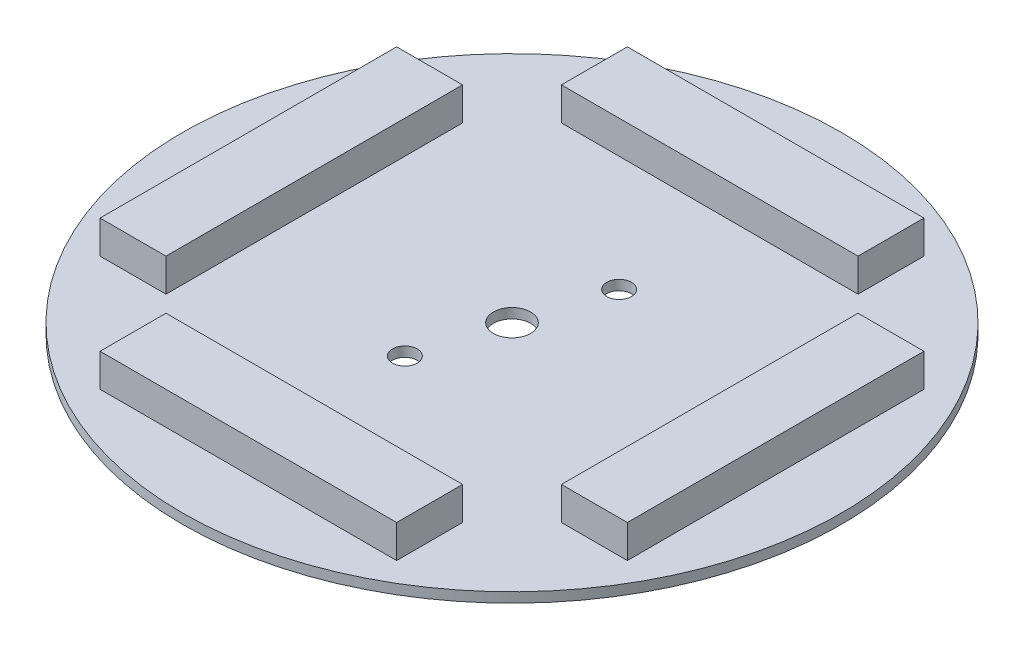
ISO-10303-21;
HEADER;
FILE_DESCRIPTION(('STEP AP214'),'2;1');
FILE_NAME('part.step','',(''),(''),'','','');
FILE_SCHEMA(('AUTOMOTIVE_DESIGN { 1 0 10303 214 1 1 1 1 }'));
ENDSEC;
DATA;
#1=APPLICATION_CONTEXT('core data for automotive mechanical design processes');
#2=APPLICATION_PROTOCOL_DEFINITION('international standard','automotive_design',2000,#1);
#3=PRODUCT_CONTEXT('',#1,'mechanical');
#4=PRODUCT('Part','Part','',(#3));
#5=PRODUCT_RELATED_PRODUCT_CATEGORY('part','',(#4));
#6=PRODUCT_DEFINITION_FORMATION('','',#4);
#7=PRODUCT_DEFINITION_CONTEXT('part definition',#1,'design');
#8=PRODUCT_DEFINITION('design','',#6,#7);
#9=PRODUCT_DEFINITION_SHAPE('','',#8);
#10=(LENGTH_UNIT() NAMED_UNIT(*) SI_UNIT(.MILLI.,.METRE.));
#11=(NAMED_UNIT(*) PLANE_ANGLE_UNIT() SI_UNIT($,.RADIAN.));
#12=(NAMED_UNIT(*) SI_UNIT($,.STERADIAN.) SOLID_ANGLE_UNIT());
#13=UNCERTAINTY_MEASURE_WITH_UNIT(LENGTH_MEASURE(1.E-05),#10,'distance_accuracy_value','');
#14=(GEOMETRIC_REPRESENTATION_CONTEXT(3) GLOBAL_UNCERTAINTY_ASSIGNED_CONTEXT((#13)) GLOBAL_UNIT_ASSIGNED_CONTEXT((#10,
#11,#12)) REPRESENTATION_CONTEXT('',''));
#15=CARTESIAN_POINT('',(0.,0.,0.));
#16=DIRECTION('',(0.,0.,1.));
#17=DIRECTION('',(1.,0.,0.));
#18=AXIS2_PLACEMENT_3D('',#15,#16,#17);
#19=CARTESIAN_POINT('',(0.,0.6,0.));
#20=DIRECTION('',(0.,1.,0.));
#21=DIRECTION('',(0.,0.,1.));
#22=AXIS2_PLACEMENT_3D('',#19,#20,#21);
#23=PLANE('',#22);
#24=CARTESIAN_POINT('',(0.,0.6,0.));
#25=DIRECTION('',(0.,1.,0.));
#26=DIRECTION('',(0.,0.,1.));
#27=AXIS2_PLACEMENT_3D('',#24,#25,#26);
#28=CIRCLE('',#27,1.1303);
#29=CARTESIAN_POINT('',(0.,0.6,1.1303));
#30=VERTEX_POINT('',#29);
#31=EDGE_CURVE('E301',#30,#30,#28,.T.);
#32=ORIENTED_EDGE('',*,*,#31,.F.);
#33=EDGE_LOOP('',(#32));
#34=FACE_BOUND('',#33,.T.);
#35=CARTESIAN_POINT('',(0.,0.6,0.));
#36=DIRECTION('',(0.,1.,0.));
#37=DIRECTION('',(0.,0.,1.));
#38=AXIS2_PLACEMENT_3D('',#35,#36,#37);
#39=CIRCLE('',#38,20.);
#40=CARTESIAN_POINT('',(0.,0.6,20.));
#41=VERTEX_POINT('',#40);
#42=EDGE_CURVE('E12',#41,#41,#39,.T.);
#43=ORIENTED_EDGE('',*,*,#42,.T.);
#44=EDGE_LOOP('',(#43));
#45=FACE_BOUND('',#44,.T.);
#46=CARTESIAN_POINT('',(-1.5,0.6,5.));
#47=DIRECTION('',(0.,1.,0.));
#48=DIRECTION('',(0.,0.,1.));
#49=AXIS2_PLACEMENT_3D('',#46,#47,#48);
#50=CIRCLE('',#49,0.75);
#51=CARTESIAN_POINT('',(-1.5,0.6,5.75));
#52=VERTEX_POINT('',#51);
#53=EDGE_CURVE('E307',#52,#52,#50,.T.);
#54=ORIENTED_EDGE('',*,*,#53,.F.);
#55=EDGE_LOOP('',(#54));
#56=FACE_BOUND('',#55,.T.);
#57=CARTESIAN_POINT('',(1.5,0.6,-5.));
#58=DIRECTION('',(0.,1.,0.));
#59=DIRECTION('',(0.,0.,1.));
#60=AXIS2_PLACEMENT_3D('',#57,#58,#59);
#61=CIRCLE('',#60,0.75);
#62=CARTESIAN_POINT('',(1.5,0.6,-4.25));
#63=VERTEX_POINT('',#62);
#64=EDGE_CURVE('E295',#63,#63,#61,.T.);
#65=ORIENTED_EDGE('',*,*,#64,.F.);
#66=EDGE_LOOP('',(#65));
#67=FACE_BOUND('',#66,.T.);
#68=DIRECTION('',(1.,0.,0.));
#69=VECTOR('',#68,1.);
#70=CARTESIAN_POINT('',(-9.,0.6,-12.));
#71=LINE('',#70,#69);
#72=CARTESIAN_POINT('',(-9.,0.6,-12.));
#73=VERTEX_POINT('',#72);
#74=CARTESIAN_POINT('',(9.,0.6,-12.));
#75=VERTEX_POINT('',#74);
#76=EDGE_CURVE('E277',#73,#75,#71,.T.);
#77=ORIENTED_EDGE('',*,*,#76,.F.);
#78=DIRECTION('',(0.,0.,1.));
#79=VECTOR('',#78,1.);
#80=CARTESIAN_POINT('',(-9.,0.6,-16.));
#81=LINE('',#80,#79);
#82=CARTESIAN_POINT('',(-9.,0.6,-16.));
#83=VERTEX_POINT('',#82);
#84=EDGE_CURVE('E261',#83,#73,#81,.T.);
#85=ORIENTED_EDGE('',*,*,#84,.F.);
#86=DIRECTION('',(1.,0.,0.));
#87=VECTOR('',#86,1.);
#88=CARTESIAN_POINT('',(-9.,0.6,-16.));
#89=LINE('',#88,#87);
#90=CARTESIAN_POINT('',(9.,0.6,-16.));
#91=VERTEX_POINT('',#90);
#92=EDGE_CURVE('E266',#83,#91,#89,.T.);
#93=ORIENTED_EDGE('',*,*,#92,.T.);
#94=DIRECTION('',(0.,0.,1.));
#95=VECTOR('',#94,1.);
#96=CARTESIAN_POINT('',(9.,0.6,-16.));
#97=LINE('',#96,#95);
#98=EDGE_CURVE('E280',#91,#75,#97,.T.);
#99=ORIENTED_EDGE('',*,*,#98,.T.);
#100=EDGE_LOOP('',(#77,#85,#93,#99));
#101=FACE_BOUND('',#100,.T.);
#102=DIRECTION('',(0.,0.,-1.));
#103=VECTOR('',#102,1.);
#104=CARTESIAN_POINT('',(-12.,0.6,9.00000000000004));
#105=LINE('',#104,#103);
#106=CARTESIAN_POINT('',(-12.,0.6,9.00000000000004));
#107=VERTEX_POINT('',#106);
#108=CARTESIAN_POINT('',(-12.,0.6,-8.99999999999996));
#109=VERTEX_POINT('',#108);
#110=EDGE_CURVE('E244',#107,#109,#105,.T.);
#111=ORIENTED_EDGE('',*,*,#110,.F.);
#112=DIRECTION('',(1.,0.,0.));
#113=VECTOR('',#112,1.);
#114=CARTESIAN_POINT('',(-16.,0.6,9.00000000000006));
#115=LINE('',#114,#113);
#116=CARTESIAN_POINT('',(-16.,0.6,9.00000000000006));
#117=VERTEX_POINT('',#116);
#118=EDGE_CURVE('E228',#117,#107,#115,.T.);
#119=ORIENTED_EDGE('',*,*,#118,.F.);
#120=DIRECTION('',(0.,0.,-1.));
#121=VECTOR('',#120,1.);
#122=CARTESIAN_POINT('',(-16.,0.6,9.00000000000006));
#123=LINE('',#122,#121);
#124=CARTESIAN_POINT('',(-16.,0.6,-8.99999999999994));
#125=VERTEX_POINT('',#124);
#126=EDGE_CURVE('E233',#117,#125,#123,.T.);
#127=ORIENTED_EDGE('',*,*,#126,.T.);
#128=DIRECTION('',(1.,0.,0.));
#129=VECTOR('',#128,1.);
#130=CARTESIAN_POINT('',(-16.,0.6,-8.99999999999994));
#131=LINE('',#130,#129);
#132=EDGE_CURVE('E247',#125,#109,#131,.T.);
#133=ORIENTED_EDGE('',*,*,#132,.T.);
#134=EDGE_LOOP('',(#111,#119,#127,#133));
#135=FACE_BOUND('',#134,.T.);
#136=DIRECTION('',(-1.,0.,0.));
#137=VECTOR('',#136,1.);
#138=CARTESIAN_POINT('',(9.,0.6,12.));
#139=LINE('',#138,#137);
#140=CARTESIAN_POINT('',(9.,0.6,12.));
#141=VERTEX_POINT('',#140);
#142=CARTESIAN_POINT('',(-9.,0.6,12.));
#143=VERTEX_POINT('',#142);
#144=EDGE_CURVE('E193',#141,#143,#139,.T.);
#145=ORIENTED_EDGE('',*,*,#144,.F.);
#146=DIRECTION('',(0.,0.,-1.));
#147=VECTOR('',#146,1.);
#148=CARTESIAN_POINT('',(9.,0.6,16.));
#149=LINE('',#148,#147);
#150=CARTESIAN_POINT('',(9.,0.6,16.));
#151=VERTEX_POINT('',#150);
#152=EDGE_CURVE('E190',#151,#141,#149,.T.);
#153=ORIENTED_EDGE('',*,*,#152,.F.);
#154=DIRECTION('',(-1.,0.,0.));
#155=VECTOR('',#154,1.);
#156=CARTESIAN_POINT('',(9.,0.6,16.));
#157=LINE('',#156,#155);
#158=CARTESIAN_POINT('',(-9.,0.6,16.));
#159=VERTEX_POINT('',#158);
#160=EDGE_CURVE('E203',#151,#159,#157,.T.);
#161=ORIENTED_EDGE('',*,*,#160,.T.);
#162=DIRECTION('',(0.,0.,-1.));
#163=VECTOR('',#162,1.);
#164=CARTESIAN_POINT('',(-9.,0.6,16.));
#165=LINE('',#164,#163);
#166=EDGE_CURVE('E214',#159,#143,#165,.T.);
#167=ORIENTED_EDGE('',*,*,#166,.T.);
#168=EDGE_LOOP('',(#145,#153,#161,#167));
#169=FACE_BOUND('',#168,.T.);
#170=DIRECTION('',(0.,0.,1.));
#171=VECTOR('',#170,1.);
#172=CARTESIAN_POINT('',(11.9999999999999,0.6,-9.00000000000012));
#173=LINE('',#172,#171);
#174=CARTESIAN_POINT('',(11.9999999999999,0.6,-9.00000000000012));
#175=VERTEX_POINT('',#174);
#176=CARTESIAN_POINT('',(12.0000000000001,0.6,8.99999999999988));
#177=VERTEX_POINT('',#176);
#178=EDGE_CURVE('E70',#175,#177,#173,.T.);
#179=ORIENTED_EDGE('',*,*,#178,.F.);
#180=DIRECTION('',(-1.,0.,0.));
#181=VECTOR('',#180,1.);
#182=CARTESIAN_POINT('',(15.9999999999999,0.6,-9.00000000000017));
#183=LINE('',#182,#181);
#184=CARTESIAN_POINT('',(15.9999999999999,0.6,-9.00000000000017));
#185=VERTEX_POINT('',#184);
#186=EDGE_CURVE('E189',#185,#175,#183,.T.);
#187=ORIENTED_EDGE('',*,*,#186,.F.);
#188=DIRECTION('',(0.,0.,1.));
#189=VECTOR('',#188,1.);
#190=CARTESIAN_POINT('',(15.9999999999999,0.6,-9.00000000000017));
#191=LINE('',#190,#189);
#192=CARTESIAN_POINT('',(16.0000000000001,0.6,8.99999999999983));
#193=VERTEX_POINT('',#192);
#194=EDGE_CURVE('E186',#185,#193,#191,.T.);
#195=ORIENTED_EDGE('',*,*,#194,.T.);
#196=DIRECTION('',(-1.,0.,0.));
#197=VECTOR('',#196,1.);
#198=CARTESIAN_POINT('',(16.0000000000001,0.6,8.99999999999983));
#199=LINE('',#198,#197);
#200=EDGE_CURVE('E75',#193,#177,#199,.T.);
#201=ORIENTED_EDGE('',*,*,#200,.T.);
#202=EDGE_LOOP('',(#179,#187,#195,#201));
#203=FACE_BOUND('',#202,.T.);
#204=ADVANCED_FACE('F55',(#34,#45,#56,#67,#101,#135,#169,#203),#23,.T.);
#205=CARTESIAN_POINT('',(0.,0.,0.));
#206=DIRECTION('',(0.,1.,0.));
#207=DIRECTION('',(0.,0.,1.));
#208=AXIS2_PLACEMENT_3D('',#205,#206,#207);
#209=PLANE('',#208);
#210=CARTESIAN_POINT('',(0.,0.,0.));
#211=DIRECTION('',(0.,1.,0.));
#212=DIRECTION('',(0.,0.,1.));
#213=AXIS2_PLACEMENT_3D('',#210,#211,#212);
#214=CIRCLE('',#213,20.);
#215=CARTESIAN_POINT('',(0.,0.,20.));
#216=VERTEX_POINT('',#215);
#217=EDGE_CURVE('E59',#216,#216,#214,.T.);
#218=ORIENTED_EDGE('',*,*,#217,.F.);
#219=EDGE_LOOP('',(#218));
#220=FACE_BOUND('',#219,.T.);
#221=CARTESIAN_POINT('',(-1.5,0.,5.));
#222=DIRECTION('',(0.,1.,0.));
#223=DIRECTION('',(0.,0.,1.));
#224=AXIS2_PLACEMENT_3D('',#221,#222,#223);
#225=CIRCLE('',#224,0.75);
#226=CARTESIAN_POINT('',(-1.5,0.,5.75));
#227=VERTEX_POINT('',#226);
#228=EDGE_CURVE('E304',#227,#227,#225,.T.);
#229=ORIENTED_EDGE('',*,*,#228,.T.);
#230=EDGE_LOOP('',(#229));
#231=FACE_BOUND('',#230,.T.);
#232=CARTESIAN_POINT('',(0.,0.,0.));
#233=DIRECTION('',(0.,1.,0.));
#234=DIRECTION('',(0.,0.,1.));
#235=AXIS2_PLACEMENT_3D('',#232,#233,#234);
#236=CIRCLE('',#235,1.1303);
#237=CARTESIAN_POINT('',(0.,0.,1.1303));
#238=VERTEX_POINT('',#237);
#239=EDGE_CURVE('E298',#238,#238,#236,.T.);
#240=ORIENTED_EDGE('',*,*,#239,.T.);
#241=EDGE_LOOP('',(#240));
#242=FACE_BOUND('',#241,.T.);
#243=CARTESIAN_POINT('',(1.5,0.,-5.));
#244=DIRECTION('',(0.,1.,0.));
#245=DIRECTION('',(0.,0.,1.));
#246=AXIS2_PLACEMENT_3D('',#243,#244,#245);
#247=CIRCLE('',#246,0.75);
#248=CARTESIAN_POINT('',(1.5,0.,-4.25));
#249=VERTEX_POINT('',#248);
#250=EDGE_CURVE('E294',#249,#249,#247,.T.);
#251=ORIENTED_EDGE('',*,*,#250,.T.);
#252=EDGE_LOOP('',(#251));
#253=FACE_BOUND('',#252,.T.);
#254=ADVANCED_FACE('F313',(#220,#231,#242,#253),#209,.F.);
#255=CARTESIAN_POINT('',(0.,0.6,0.));
#256=DIRECTION('',(0.,-1.,0.));
#257=DIRECTION('',(0.,0.,-1.));
#258=AXIS2_PLACEMENT_3D('',#255,#256,#257);
#259=CYLINDRICAL_SURFACE('',#258,20.);
#260=ORIENTED_EDGE('',*,*,#42,.F.);
#261=EDGE_LOOP('',(#260));
#262=FACE_BOUND('',#261,.T.);
#263=ORIENTED_EDGE('',*,*,#217,.T.);
#264=EDGE_LOOP('',(#263));
#265=FACE_BOUND('',#264,.T.);
#266=ADVANCED_FACE('F57',(#262,#265),#259,.T.);
#267=CARTESIAN_POINT('',(-1.5,0.6,5.));
#268=DIRECTION('',(0.,-1.,0.));
#269=DIRECTION('',(0.,0.,-1.));
#270=AXIS2_PLACEMENT_3D('',#267,#268,#269);
#271=CYLINDRICAL_SURFACE('',#270,0.75);
#272=ORIENTED_EDGE('',*,*,#53,.T.);
#273=EDGE_LOOP('',(#272));
#274=FACE_BOUND('',#273,.T.);
#275=ORIENTED_EDGE('',*,*,#228,.F.);
#276=EDGE_LOOP('',(#275));
#277=FACE_BOUND('',#276,.T.);
#278=ADVANCED_FACE('F316',(#274,#277),#271,.F.);
#279=CARTESIAN_POINT('',(0.,0.6,0.));
#280=DIRECTION('',(0.,-1.,0.));
#281=DIRECTION('',(0.,0.,-1.));
#282=AXIS2_PLACEMENT_3D('',#279,#280,#281);
#283=CYLINDRICAL_SURFACE('',#282,1.1303);
#284=ORIENTED_EDGE('',*,*,#31,.T.);
#285=EDGE_LOOP('',(#284));
#286=FACE_BOUND('',#285,.T.);
#287=ORIENTED_EDGE('',*,*,#239,.F.);
#288=EDGE_LOOP('',(#287));
#289=FACE_BOUND('',#288,.T.);
#290=ADVANCED_FACE('F318',(#286,#289),#283,.F.);
#291=CARTESIAN_POINT('',(1.5,0.6,-5.));
#292=DIRECTION('',(0.,-1.,0.));
#293=DIRECTION('',(0.,0.,-1.));
#294=AXIS2_PLACEMENT_3D('',#291,#292,#293);
#295=CYLINDRICAL_SURFACE('',#294,0.75);
#296=ORIENTED_EDGE('',*,*,#64,.T.);
#297=EDGE_LOOP('',(#296));
#298=FACE_BOUND('',#297,.T.);
#299=ORIENTED_EDGE('',*,*,#250,.F.);
#300=EDGE_LOOP('',(#299));
#301=FACE_BOUND('',#300,.T.);
#302=ADVANCED_FACE('F325',(#298,#301),#295,.F.);
#303=CARTESIAN_POINT('',(-9.,2.6,-16.));
#304=DIRECTION('',(1.,0.,0.));
#305=DIRECTION('',(0.,0.,-1.));
#306=AXIS2_PLACEMENT_3D('',#303,#304,#305);
#307=PLANE('',#306);
#308=ORIENTED_EDGE('',*,*,#84,.T.);
#309=DIRECTION('',(0.,-1.,0.));
#310=VECTOR('',#309,1.);
#311=CARTESIAN_POINT('',(-9.,2.6,-12.));
#312=LINE('',#311,#310);
#313=CARTESIAN_POINT('',(-9.,2.6,-12.));
#314=VERTEX_POINT('',#313);
#315=EDGE_CURVE('E291',#314,#73,#312,.T.);
#316=ORIENTED_EDGE('',*,*,#315,.F.);
#317=DIRECTION('',(0.,0.,1.));
#318=VECTOR('',#317,1.);
#319=CARTESIAN_POINT('',(-9.,2.6,-16.));
#320=LINE('',#319,#318);
#321=CARTESIAN_POINT('',(-9.,2.6,-16.));
#322=VERTEX_POINT('',#321);
#323=EDGE_CURVE('E262',#322,#314,#320,.T.);
#324=ORIENTED_EDGE('',*,*,#323,.F.);
#325=DIRECTION('',(0.,-1.,0.));
#326=VECTOR('',#325,1.);
#327=CARTESIAN_POINT('',(-9.,2.6,-16.));
#328=LINE('',#327,#326);
#329=EDGE_CURVE('E274',#322,#83,#328,.T.);
#330=ORIENTED_EDGE('',*,*,#329,.T.);
#331=EDGE_LOOP('',(#308,#316,#324,#330));
#332=FACE_BOUND('',#331,.T.);
#333=ADVANCED_FACE('F414',(#332),#307,.F.);
#334=CARTESIAN_POINT('',(-9.,2.6,-12.));
#335=DIRECTION('',(0.,0.,-1.));
#336=DIRECTION('',(-1.,0.,0.));
#337=AXIS2_PLACEMENT_3D('',#334,#335,#336);
#338=PLANE('',#337);
#339=ORIENTED_EDGE('',*,*,#76,.T.);
#340=DIRECTION('',(0.,-1.,0.));
#341=VECTOR('',#340,1.);
#342=CARTESIAN_POINT('',(9.,2.6,-12.));
#343=LINE('',#342,#341);
#344=CARTESIAN_POINT('',(9.,2.6,-12.));
#345=VERTEX_POINT('',#344);
#346=EDGE_CURVE('E288',#345,#75,#343,.T.);
#347=ORIENTED_EDGE('',*,*,#346,.F.);
#348=DIRECTION('',(1.,0.,0.));
#349=VECTOR('',#348,1.);
#350=CARTESIAN_POINT('',(-9.,2.6,-12.));
#351=LINE('',#350,#349);
#352=EDGE_CURVE('E265',#314,#345,#351,.T.);
#353=ORIENTED_EDGE('',*,*,#352,.F.);
#354=ORIENTED_EDGE('',*,*,#315,.T.);
#355=EDGE_LOOP('',(#339,#347,#353,#354));
#356=FACE_BOUND('',#355,.T.);
#357=ADVANCED_FACE('F410',(#356),#338,.F.);
#358=CARTESIAN_POINT('',(9.,2.6,-16.));
#359=DIRECTION('',(1.,0.,0.));
#360=DIRECTION('',(0.,0.,-1.));
#361=AXIS2_PLACEMENT_3D('',#358,#359,#360);
#362=PLANE('',#361);
#363=ORIENTED_EDGE('',*,*,#98,.F.);
#364=DIRECTION('',(0.,-1.,0.));
#365=VECTOR('',#364,1.);
#366=CARTESIAN_POINT('',(9.,2.6,-16.));
#367=LINE('',#366,#365);
#368=CARTESIAN_POINT('',(9.,2.6,-16.));
#369=VERTEX_POINT('',#368);
#370=EDGE_CURVE('E285',#369,#91,#367,.T.);
#371=ORIENTED_EDGE('',*,*,#370,.F.);
#372=DIRECTION('',(0.,0.,1.));
#373=VECTOR('',#372,1.);
#374=CARTESIAN_POINT('',(9.,2.6,-16.));
#375=LINE('',#374,#373);
#376=EDGE_CURVE('E268',#369,#345,#375,.T.);
#377=ORIENTED_EDGE('',*,*,#376,.T.);
#378=ORIENTED_EDGE('',*,*,#346,.T.);
#379=EDGE_LOOP('',(#363,#371,#377,#378));
#380=FACE_BOUND('',#379,.T.);
#381=ADVANCED_FACE('F406',(#380),#362,.T.);
#382=CARTESIAN_POINT('',(-9.,2.6,-16.));
#383=DIRECTION('',(0.,0.,-1.));
#384=DIRECTION('',(-1.,0.,0.));
#385=AXIS2_PLACEMENT_3D('',#382,#383,#384);
#386=PLANE('',#385);
#387=ORIENTED_EDGE('',*,*,#92,.F.);
#388=ORIENTED_EDGE('',*,*,#329,.F.);
#389=DIRECTION('',(1.,0.,0.));
#390=VECTOR('',#389,1.);
#391=CARTESIAN_POINT('',(-9.,2.6,-16.));
#392=LINE('',#391,#390);
#393=EDGE_CURVE('E271',#322,#369,#392,.T.);
#394=ORIENTED_EDGE('',*,*,#393,.T.);
#395=ORIENTED_EDGE('',*,*,#370,.T.);
#396=EDGE_LOOP('',(#387,#388,#394,#395));
#397=FACE_BOUND('',#396,.T.);
#398=ADVANCED_FACE('F402',(#397),#386,.T.);
#399=CARTESIAN_POINT('',(0.,2.6,0.));
#400=DIRECTION('',(0.,1.,0.));
#401=DIRECTION('',(0.,0.,1.));
#402=AXIS2_PLACEMENT_3D('',#399,#400,#401);
#403=PLANE('',#402);
#404=ORIENTED_EDGE('',*,*,#323,.T.);
#405=ORIENTED_EDGE('',*,*,#352,.T.);
#406=ORIENTED_EDGE('',*,*,#376,.F.);
#407=ORIENTED_EDGE('',*,*,#393,.F.);
#408=EDGE_LOOP('',(#404,#405,#406,#407));
#409=FACE_BOUND('',#408,.T.);
#410=ADVANCED_FACE('F398',(#409),#403,.T.);
#411=CARTESIAN_POINT('',(-16.,2.6,9.00000000000006));
#412=DIRECTION('',(0.,0.,-1.));
#413=DIRECTION('',(-1.,0.,0.));
#414=AXIS2_PLACEMENT_3D('',#411,#412,#413);
#415=PLANE('',#414);
#416=ORIENTED_EDGE('',*,*,#118,.T.);
#417=DIRECTION('',(0.,-1.,0.));
#418=VECTOR('',#417,1.);
#419=CARTESIAN_POINT('',(-12.,2.6,9.00000000000004));
#420=LINE('',#419,#418);
#421=CARTESIAN_POINT('',(-12.,2.6,9.00000000000004));
#422=VERTEX_POINT('',#421);
#423=EDGE_CURVE('E258',#422,#107,#420,.T.);
#424=ORIENTED_EDGE('',*,*,#423,.F.);
#425=DIRECTION('',(1.,0.,0.));
#426=VECTOR('',#425,1.);
#427=CARTESIAN_POINT('',(-16.,2.6,9.00000000000006));
#428=LINE('',#427,#426);
#429=CARTESIAN_POINT('',(-16.,2.6,9.00000000000006));
#430=VERTEX_POINT('',#429);
#431=EDGE_CURVE('E229',#430,#422,#428,.T.);
#432=ORIENTED_EDGE('',*,*,#431,.F.);
#433=DIRECTION('',(0.,-1.,0.));
#434=VECTOR('',#433,1.);
#435=CARTESIAN_POINT('',(-16.,2.6,9.00000000000006));
#436=LINE('',#435,#434);
#437=EDGE_CURVE('E241',#430,#117,#436,.T.);
#438=ORIENTED_EDGE('',*,*,#437,.T.);
#439=EDGE_LOOP('',(#416,#424,#432,#438));
#440=FACE_BOUND('',#439,.T.);
#441=ADVANCED_FACE('F394',(#440),#415,.F.);
#442=CARTESIAN_POINT('',(-12.,2.6,9.00000000000004));
#443=DIRECTION('',(-1.,0.,0.));
#444=DIRECTION('',(0.,0.,1.));
#445=AXIS2_PLACEMENT_3D('',#442,#443,#444);
#446=PLANE('',#445);
#447=ORIENTED_EDGE('',*,*,#110,.T.);
#448=DIRECTION('',(0.,-1.,0.));
#449=VECTOR('',#448,1.);
#450=CARTESIAN_POINT('',(-12.,2.6,-8.99999999999996));
#451=LINE('',#450,#449);
#452=CARTESIAN_POINT('',(-12.,2.6,-8.99999999999996));
#453=VERTEX_POINT('',#452);
#454=EDGE_CURVE('E255',#453,#109,#451,.T.);
#455=ORIENTED_EDGE('',*,*,#454,.F.);
#456=DIRECTION('',(0.,0.,-1.));
#457=VECTOR('',#456,1.);
#458=CARTESIAN_POINT('',(-12.,2.6,9.00000000000004));
#459=LINE('',#458,#457);
#460=EDGE_CURVE('E232',#422,#453,#459,.T.);
#461=ORIENTED_EDGE('',*,*,#460,.F.);
#462=ORIENTED_EDGE('',*,*,#423,.T.);
#463=EDGE_LOOP('',(#447,#455,#461,#462));
#464=FACE_BOUND('',#463,.T.);
#465=ADVANCED_FACE('F390',(#464),#446,.F.);
#466=CARTESIAN_POINT('',(-16.,2.6,-8.99999999999994));
#467=DIRECTION('',(0.,0.,-1.));
#468=DIRECTION('',(-1.,0.,0.));
#469=AXIS2_PLACEMENT_3D('',#466,#467,#468);
#470=PLANE('',#469);
#471=ORIENTED_EDGE('',*,*,#132,.F.);
#472=DIRECTION('',(0.,-1.,0.));
#473=VECTOR('',#472,1.);
#474=CARTESIAN_POINT('',(-16.,2.6,-8.99999999999994));
#475=LINE('',#474,#473);
#476=CARTESIAN_POINT('',(-16.,2.6,-8.99999999999994));
#477=VERTEX_POINT('',#476);
#478=EDGE_CURVE('E252',#477,#125,#475,.T.);
#479=ORIENTED_EDGE('',*,*,#478,.F.);
#480=DIRECTION('',(1.,0.,0.));
#481=VECTOR('',#480,1.);
#482=CARTESIAN_POINT('',(-16.,2.6,-8.99999999999994));
#483=LINE('',#482,#481);
#484=EDGE_CURVE('E235',#477,#453,#483,.T.);
#485=ORIENTED_EDGE('',*,*,#484,.T.);
#486=ORIENTED_EDGE('',*,*,#454,.T.);
#487=EDGE_LOOP('',(#471,#479,#485,#486));
#488=FACE_BOUND('',#487,.T.);
#489=ADVANCED_FACE('F386',(#488),#470,.T.);
#490=CARTESIAN_POINT('',(-16.,2.6,9.00000000000006));
#491=DIRECTION('',(-1.,0.,0.));
#492=DIRECTION('',(0.,0.,1.));
#493=AXIS2_PLACEMENT_3D('',#490,#491,#492);
#494=PLANE('',#493);
#495=ORIENTED_EDGE('',*,*,#126,.F.);
#496=ORIENTED_EDGE('',*,*,#437,.F.);
#497=DIRECTION('',(0.,0.,-1.));
#498=VECTOR('',#497,1.);
#499=CARTESIAN_POINT('',(-16.,2.6,9.00000000000006));
#500=LINE('',#499,#498);
#501=EDGE_CURVE('E238',#430,#477,#500,.T.);
#502=ORIENTED_EDGE('',*,*,#501,.T.);
#503=ORIENTED_EDGE('',*,*,#478,.T.);
#504=EDGE_LOOP('',(#495,#496,#502,#503));
#505=FACE_BOUND('',#504,.T.);
#506=ADVANCED_FACE('F382',(#505),#494,.T.);
#507=CARTESIAN_POINT('',(0.,2.6,0.));
#508=DIRECTION('',(0.,1.,0.));
#509=DIRECTION('',(1.,0.,0.));
#510=AXIS2_PLACEMENT_3D('',#507,#508,#509);
#511=PLANE('',#510);
#512=ORIENTED_EDGE('',*,*,#431,.T.);
#513=ORIENTED_EDGE('',*,*,#460,.T.);
#514=ORIENTED_EDGE('',*,*,#484,.F.);
#515=ORIENTED_EDGE('',*,*,#501,.F.);
#516=EDGE_LOOP('',(#512,#513,#514,#515));
#517=FACE_BOUND('',#516,.T.);
#518=ADVANCED_FACE('F379',(#517),#511,.T.);
#519=CARTESIAN_POINT('',(9.,2.6,16.));
#520=DIRECTION('',(-1.,0.,0.));
#521=DIRECTION('',(0.,0.,1.));
#522=AXIS2_PLACEMENT_3D('',#519,#520,#521);
#523=PLANE('',#522);
#524=ORIENTED_EDGE('',*,*,#152,.T.);
#525=DIRECTION('',(0.,-1.,0.));
#526=VECTOR('',#525,1.);
#527=CARTESIAN_POINT('',(9.,2.6,12.));
#528=LINE('',#527,#526);
#529=CARTESIAN_POINT('',(9.,2.6,12.));
#530=VERTEX_POINT('',#529);
#531=EDGE_CURVE('E225',#530,#141,#528,.T.);
#532=ORIENTED_EDGE('',*,*,#531,.F.);
#533=DIRECTION('',(0.,0.,-1.));
#534=VECTOR('',#533,1.);
#535=CARTESIAN_POINT('',(9.,2.6,16.));
#536=LINE('',#535,#534);
#537=CARTESIAN_POINT('',(9.,2.6,16.));
#538=VERTEX_POINT('',#537);
#539=EDGE_CURVE('E199',#538,#530,#536,.T.);
#540=ORIENTED_EDGE('',*,*,#539,.F.);
#541=DIRECTION('',(0.,-1.,0.));
#542=VECTOR('',#541,1.);
#543=CARTESIAN_POINT('',(9.,2.6,16.));
#544=LINE('',#543,#542);
#545=EDGE_CURVE('E210',#538,#151,#544,.T.);
#546=ORIENTED_EDGE('',*,*,#545,.T.);
#547=EDGE_LOOP('',(#524,#532,#540,#546));
#548=FACE_BOUND('',#547,.T.);
#549=ADVANCED_FACE('F353',(#548),#523,.F.);
#550=CARTESIAN_POINT('',(9.,2.6,12.));
#551=DIRECTION('',(0.,0.,1.));
#552=DIRECTION('',(1.,0.,0.));
#553=AXIS2_PLACEMENT_3D('',#550,#551,#552);
#554=PLANE('',#553);
#555=ORIENTED_EDGE('',*,*,#144,.T.);
#556=DIRECTION('',(0.,-1.,0.));
#557=VECTOR('',#556,1.);
#558=CARTESIAN_POINT('',(-9.,2.6,12.));
#559=LINE('',#558,#557);
#560=CARTESIAN_POINT('',(-9.,2.6,12.));
#561=VERTEX_POINT('',#560);
#562=EDGE_CURVE('E222',#561,#143,#559,.T.);
#563=ORIENTED_EDGE('',*,*,#562,.F.);
#564=DIRECTION('',(-1.,0.,0.));
#565=VECTOR('',#564,1.);
#566=CARTESIAN_POINT('',(9.,2.6,12.));
#567=LINE('',#566,#565);
#568=EDGE_CURVE('E202',#530,#561,#567,.T.);
#569=ORIENTED_EDGE('',*,*,#568,.F.);
#570=ORIENTED_EDGE('',*,*,#531,.T.);
#571=EDGE_LOOP('',(#555,#563,#569,#570));
#572=FACE_BOUND('',#571,.T.);
#573=ADVANCED_FACE('F350',(#572),#554,.F.);
#574=CARTESIAN_POINT('',(-9.,2.6,16.));
#575=DIRECTION('',(-1.,0.,0.));
#576=DIRECTION('',(0.,0.,1.));
#577=AXIS2_PLACEMENT_3D('',#574,#575,#576);
#578=PLANE('',#577);
#579=ORIENTED_EDGE('',*,*,#166,.F.);
#580=DIRECTION('',(0.,-1.,0.));
#581=VECTOR('',#580,1.);
#582=CARTESIAN_POINT('',(-9.,2.6,16.));
#583=LINE('',#582,#581);
#584=CARTESIAN_POINT('',(-9.,2.6,16.));
#585=VERTEX_POINT('',#584);
#586=EDGE_CURVE('E219',#585,#159,#583,.T.);
#587=ORIENTED_EDGE('',*,*,#586,.F.);
#588=DIRECTION('',(0.,0.,-1.));
#589=VECTOR('',#588,1.);
#590=CARTESIAN_POINT('',(-9.,2.6,16.));
#591=LINE('',#590,#589);
#592=EDGE_CURVE('E205',#585,#561,#591,.T.);
#593=ORIENTED_EDGE('',*,*,#592,.T.);
#594=ORIENTED_EDGE('',*,*,#562,.T.);
#595=EDGE_LOOP('',(#579,#587,#593,#594));
#596=FACE_BOUND('',#595,.T.);
#597=ADVANCED_FACE('F360',(#596),#578,.T.);
#598=CARTESIAN_POINT('',(9.,2.6,16.));
#599=DIRECTION('',(0.,0.,1.));
#600=DIRECTION('',(1.,0.,0.));
#601=AXIS2_PLACEMENT_3D('',#598,#599,#600);
#602=PLANE('',#601);
#603=ORIENTED_EDGE('',*,*,#160,.F.);
#604=ORIENTED_EDGE('',*,*,#545,.F.);
#605=DIRECTION('',(-1.,0.,0.));
#606=VECTOR('',#605,1.);
#607=CARTESIAN_POINT('',(9.,2.6,16.));
#608=LINE('',#607,#606);
#609=EDGE_CURVE('E208',#538,#585,#608,.T.);
#610=ORIENTED_EDGE('',*,*,#609,.T.);
#611=ORIENTED_EDGE('',*,*,#586,.T.);
#612=EDGE_LOOP('',(#603,#604,#610,#611));
#613=FACE_BOUND('',#612,.T.);
#614=ADVANCED_FACE('F357',(#613),#602,.T.);
#615=CARTESIAN_POINT('',(0.,2.6,0.));
#616=DIRECTION('',(0.,1.,0.));
#617=DIRECTION('',(0.,0.,-1.));
#618=AXIS2_PLACEMENT_3D('',#615,#616,#617);
#619=PLANE('',#618);
#620=ORIENTED_EDGE('',*,*,#539,.T.);
#621=ORIENTED_EDGE('',*,*,#568,.T.);
#622=ORIENTED_EDGE('',*,*,#592,.F.);
#623=ORIENTED_EDGE('',*,*,#609,.F.);
#624=EDGE_LOOP('',(#620,#621,#622,#623));
#625=FACE_BOUND('',#624,.T.);
#626=ADVANCED_FACE('F362',(#625),#619,.T.);
#627=CARTESIAN_POINT('',(15.9999999999999,2.6,-9.00000000000017));
#628=DIRECTION('',(0.,0.,1.));
#629=DIRECTION('',(1.,0.,0.));
#630=AXIS2_PLACEMENT_3D('',#627,#628,#629);
#631=PLANE('',#630);
#632=ORIENTED_EDGE('',*,*,#186,.T.);
#633=DIRECTION('',(0.,-1.,0.));
#634=VECTOR('',#633,1.);
#635=CARTESIAN_POINT('',(11.9999999999999,2.6,-9.00000000000012));
#636=LINE('',#635,#634);
#637=CARTESIAN_POINT('',(11.9999999999999,2.6,-9.00000000000012));
#638=VERTEX_POINT('',#637);
#639=EDGE_CURVE('E170',#638,#175,#636,.T.);
#640=ORIENTED_EDGE('',*,*,#639,.F.);
#641=DIRECTION('',(-1.,0.,0.));
#642=VECTOR('',#641,1.);
#643=CARTESIAN_POINT('',(15.9999999999999,2.6,-9.00000000000017));
#644=LINE('',#643,#642);
#645=CARTESIAN_POINT('',(15.9999999999999,2.6,-9.00000000000017));
#646=VERTEX_POINT('',#645);
#647=EDGE_CURVE('E177',#646,#638,#644,.T.);
#648=ORIENTED_EDGE('',*,*,#647,.F.);
#649=DIRECTION('',(0.,-1.,0.));
#650=VECTOR('',#649,1.);
#651=CARTESIAN_POINT('',(15.9999999999999,2.6,-9.00000000000017));
#652=LINE('',#651,#650);
#653=EDGE_CURVE('E551',#646,#185,#652,.T.);
#654=ORIENTED_EDGE('',*,*,#653,.T.);
#655=EDGE_LOOP('',(#632,#640,#648,#654));
#656=FACE_BOUND('',#655,.T.);
#657=ADVANCED_FACE('F188',(#656),#631,.F.);
#658=CARTESIAN_POINT('',(11.9999999999999,2.6,-9.00000000000012));
#659=DIRECTION('',(1.,0.,0.));
#660=DIRECTION('',(0.,0.,-1.));
#661=AXIS2_PLACEMENT_3D('',#658,#659,#660);
#662=PLANE('',#661);
#663=ORIENTED_EDGE('',*,*,#178,.T.);
#664=DIRECTION('',(0.,-1.,0.));
#665=VECTOR('',#664,1.);
#666=CARTESIAN_POINT('',(12.0000000000001,2.6,8.99999999999988));
#667=LINE('',#666,#665);
#668=CARTESIAN_POINT('',(12.0000000000001,2.6,8.99999999999988));
#669=VERTEX_POINT('',#668);
#670=EDGE_CURVE('E172',#669,#177,#667,.T.);
#671=ORIENTED_EDGE('',*,*,#670,.F.);
#672=DIRECTION('',(0.,0.,1.));
#673=VECTOR('',#672,1.);
#674=CARTESIAN_POINT('',(11.9999999999999,2.6,-9.00000000000012));
#675=LINE('',#674,#673);
#676=EDGE_CURVE('E166',#638,#669,#675,.T.);
#677=ORIENTED_EDGE('',*,*,#676,.F.);
#678=ORIENTED_EDGE('',*,*,#639,.T.);
#679=EDGE_LOOP('',(#663,#671,#677,#678));
#680=FACE_BOUND('',#679,.T.);
#681=ADVANCED_FACE('F168',(#680),#662,.F.);
#682=CARTESIAN_POINT('',(16.0000000000001,2.6,8.99999999999983));
#683=DIRECTION('',(0.,0.,1.));
#684=DIRECTION('',(1.,0.,0.));
#685=AXIS2_PLACEMENT_3D('',#682,#683,#684);
#686=PLANE('',#685);
#687=ORIENTED_EDGE('',*,*,#200,.F.);
#688=DIRECTION('',(0.,-1.,0.));
#689=VECTOR('',#688,1.);
#690=CARTESIAN_POINT('',(16.0000000000001,2.6,8.99999999999983));
#691=LINE('',#690,#689);
#692=CARTESIAN_POINT('',(16.0000000000001,2.6,8.99999999999983));
#693=VERTEX_POINT('',#692);
#694=EDGE_CURVE('E195',#693,#193,#691,.T.);
#695=ORIENTED_EDGE('',*,*,#694,.F.);
#696=DIRECTION('',(-1.,0.,0.));
#697=VECTOR('',#696,1.);
#698=CARTESIAN_POINT('',(16.0000000000001,2.6,8.99999999999983));
#699=LINE('',#698,#697);
#700=EDGE_CURVE('E176',#693,#669,#699,.T.);
#701=ORIENTED_EDGE('',*,*,#700,.T.);
#702=ORIENTED_EDGE('',*,*,#670,.T.);
#703=EDGE_LOOP('',(#687,#695,#701,#702));
#704=FACE_BOUND('',#703,.T.);
#705=ADVANCED_FACE('F512',(#704),#686,.T.);
#706=CARTESIAN_POINT('',(15.9999999999999,2.6,-9.00000000000017));
#707=DIRECTION('',(1.,0.,0.));
#708=DIRECTION('',(0.,0.,-1.));
#709=AXIS2_PLACEMENT_3D('',#706,#707,#708);
#710=PLANE('',#709);
#711=ORIENTED_EDGE('',*,*,#194,.F.);
#712=ORIENTED_EDGE('',*,*,#653,.F.);
#713=DIRECTION('',(0.,0.,1.));
#714=VECTOR('',#713,1.);
#715=CARTESIAN_POINT('',(15.9999999999999,2.6,-9.00000000000017));
#716=LINE('',#715,#714);
#717=EDGE_CURVE('E183',#646,#693,#716,.T.);
#718=ORIENTED_EDGE('',*,*,#717,.T.);
#719=ORIENTED_EDGE('',*,*,#694,.T.);
#720=EDGE_LOOP('',(#711,#712,#718,#719));
#721=FACE_BOUND('',#720,.T.);
#722=ADVANCED_FACE('F522',(#721),#710,.T.);
#723=CARTESIAN_POINT('',(0.,2.6,0.));
#724=DIRECTION('',(0.,1.,0.));
#725=DIRECTION('',(-1.,0.,0.));
#726=AXIS2_PLACEMENT_3D('',#723,#724,#725);
#727=PLANE('',#726);
#728=ORIENTED_EDGE('',*,*,#647,.T.);
#729=ORIENTED_EDGE('',*,*,#676,.T.);
#730=ORIENTED_EDGE('',*,*,#700,.F.);
#731=ORIENTED_EDGE('',*,*,#717,.F.);
#732=EDGE_LOOP('',(#728,#729,#730,#731));
#733=FACE_BOUND('',#732,.T.);
#734=ADVANCED_FACE('F181',(#733),#727,.T.);
#735=CLOSED_SHELL('',(#204,#254,#266,#278,#290,#302,#333,#357,#381,#398,#410,#441,#465,#489,
#506,#518,#549,#573,#597,#614,#626,#657,#681,#705,#722,#734));
#736=MANIFOLD_SOLID_BREP('B2',#735);
#737=ADVANCED_BREP_SHAPE_REPRESENTATION('',(#18,#736),#14);
#738=SHAPE_DEFINITION_REPRESENTATION(#9,#737);
ENDSEC;
END-ISO-10303-21;
